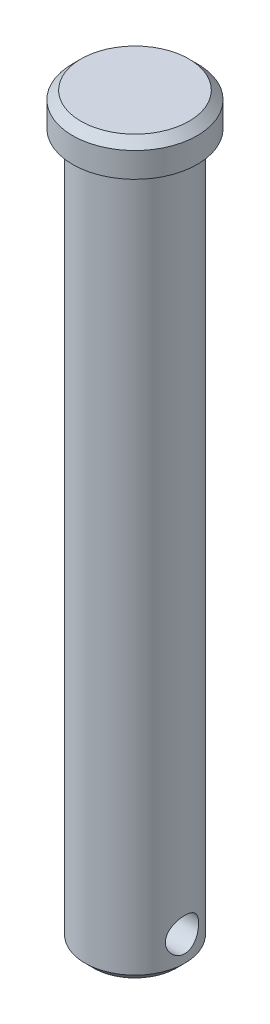
ISO-10303-21;
HEADER;
FILE_DESCRIPTION(('STEP AP214'),'2;1');
FILE_NAME('part.step','',(''),(''),'','','');
FILE_SCHEMA(('AUTOMOTIVE_DESIGN { 1 0 10303 214 1 1 1 1 }'));
ENDSEC;
DATA;
#1=APPLICATION_CONTEXT('core data for automotive mechanical design processes');
#2=APPLICATION_PROTOCOL_DEFINITION('international standard','automotive_design',2000,#1);
#3=PRODUCT_CONTEXT('',#1,'mechanical');
#4=PRODUCT('Part','Part','',(#3));
#5=PRODUCT_RELATED_PRODUCT_CATEGORY('part','',(#4));
#6=PRODUCT_DEFINITION_FORMATION('','',#4);
#7=PRODUCT_DEFINITION_CONTEXT('part definition',#1,'design');
#8=PRODUCT_DEFINITION('design','',#6,#7);
#9=PRODUCT_DEFINITION_SHAPE('','',#8);
#10=(LENGTH_UNIT() NAMED_UNIT(*) SI_UNIT(.MILLI.,.METRE.));
#11=(NAMED_UNIT(*) PLANE_ANGLE_UNIT() SI_UNIT($,.RADIAN.));
#12=(NAMED_UNIT(*) SI_UNIT($,.STERADIAN.) SOLID_ANGLE_UNIT());
#13=UNCERTAINTY_MEASURE_WITH_UNIT(LENGTH_MEASURE(1.E-05),#10,'distance_accuracy_value','');
#14=(GEOMETRIC_REPRESENTATION_CONTEXT(3) GLOBAL_UNCERTAINTY_ASSIGNED_CONTEXT((#13)) GLOBAL_UNIT_ASSIGNED_CONTEXT((#10,
#11,#12)) REPRESENTATION_CONTEXT('',''));
#15=CARTESIAN_POINT('',(0.,0.,0.));
#16=DIRECTION('',(0.,0.,1.));
#17=DIRECTION('',(1.,0.,0.));
#18=AXIS2_PLACEMENT_3D('',#15,#16,#17);
#19=CARTESIAN_POINT('',(0.,8.,0.));
#20=DIRECTION('',(0.,-1.,0.));
#21=DIRECTION('',(0.,0.,-1.));
#22=AXIS2_PLACEMENT_3D('',#19,#20,#21);
#23=CYLINDRICAL_SURFACE('',#22,15.);
#24=CARTESIAN_POINT('',(0.,5.99999999999998,0.));
#25=DIRECTION('',(0.,1.,0.));
#26=DIRECTION('',(0.,0.,1.));
#27=AXIS2_PLACEMENT_3D('',#24,#25,#26);
#28=CIRCLE('',#27,15.);
#29=CARTESIAN_POINT('',(0.,5.99999999999998,15.));
#30=VERTEX_POINT('',#29);
#31=EDGE_CURVE('E12',#30,#30,#28,.F.);
#32=ORIENTED_EDGE('',*,*,#31,.T.);
#33=EDGE_LOOP('',(#32));
#34=FACE_BOUND('',#33,.T.);
#35=CARTESIAN_POINT('',(0.,0.,0.));
#36=DIRECTION('',(0.,1.,0.));
#37=DIRECTION('',(0.,0.,1.));
#38=AXIS2_PLACEMENT_3D('',#35,#36,#37);
#39=CIRCLE('',#38,15.);
#40=CARTESIAN_POINT('',(0.,0.,15.));
#41=VERTEX_POINT('',#40);
#42=EDGE_CURVE('E80',#41,#41,#39,.T.);
#43=ORIENTED_EDGE('',*,*,#42,.T.);
#44=EDGE_LOOP('',(#43));
#45=FACE_BOUND('',#44,.T.);
#46=ADVANCED_FACE('F51',(#34,#45),#23,.T.);
#47=CARTESIAN_POINT('',(0.,8.,0.));
#48=DIRECTION('',(0.,1.,0.));
#49=DIRECTION('',(0.,0.,1.));
#50=AXIS2_PLACEMENT_3D('',#47,#48,#49);
#51=PLANE('',#50);
#52=CARTESIAN_POINT('',(0.,8.,0.));
#53=DIRECTION('',(0.,1.,0.));
#54=DIRECTION('',(0.,0.,1.));
#55=AXIS2_PLACEMENT_3D('',#52,#53,#54);
#56=CIRCLE('',#55,13.);
#57=CARTESIAN_POINT('',(0.,8.,13.));
#58=VERTEX_POINT('',#57);
#59=EDGE_CURVE('E58',#58,#58,#56,.T.);
#60=ORIENTED_EDGE('',*,*,#59,.T.);
#61=EDGE_LOOP('',(#60));
#62=FACE_BOUND('',#61,.T.);
#63=ADVANCED_FACE('F106',(#62),#51,.T.);
#64=CARTESIAN_POINT('',(0.,0.,0.));
#65=DIRECTION('',(0.,1.,0.));
#66=DIRECTION('',(0.,0.,1.));
#67=AXIS2_PLACEMENT_3D('',#64,#65,#66);
#68=PLANE('',#67);
#69=CARTESIAN_POINT('',(0.,0.,0.));
#70=DIRECTION('',(0.,-1.,0.));
#71=DIRECTION('',(0.,0.,-1.));
#72=AXIS2_PLACEMENT_3D('',#69,#70,#71);
#73=CIRCLE('',#72,12.);
#74=CARTESIAN_POINT('',(0.,0.,-12.));
#75=VERTEX_POINT('',#74);
#76=EDGE_CURVE('E71',#75,#75,#73,.T.);
#77=ORIENTED_EDGE('',*,*,#76,.F.);
#78=EDGE_LOOP('',(#77));
#79=FACE_BOUND('',#78,.T.);
#80=ORIENTED_EDGE('',*,*,#42,.F.);
#81=EDGE_LOOP('',(#80));
#82=FACE_BOUND('',#81,.T.);
#83=ADVANCED_FACE('F103',(#79,#82),#68,.F.);
#84=CARTESIAN_POINT('',(0.,-170.,0.));
#85=DIRECTION('',(0.,1.,0.));
#86=DIRECTION('',(0.,0.,1.));
#87=AXIS2_PLACEMENT_3D('',#84,#85,#86);
#88=CYLINDRICAL_SURFACE('',#87,12.);
#89=CARTESIAN_POINT('',(0.,-168.,0.));
#90=DIRECTION('',(0.,-1.,0.));
#91=DIRECTION('',(0.,0.,-1.));
#92=AXIS2_PLACEMENT_3D('',#89,#90,#91);
#93=CIRCLE('',#92,12.);
#94=CARTESIAN_POINT('',(0.,-168.,-12.));
#95=VERTEX_POINT('',#94);
#96=EDGE_CURVE('E62',#95,#95,#93,.F.);
#97=ORIENTED_EDGE('',*,*,#96,.T.);
#98=EDGE_LOOP('',(#97));
#99=FACE_BOUND('',#98,.T.);
#100=CARTESIAN_POINT('',(-11.3137084989848,-162.,-4.00000000000001));
#101=CARTESIAN_POINT('',(-11.3137077812174,-161.782127300656,-4.00000103179086));
#102=CARTESIAN_POINT('',(-11.3200707716343,-161.564260800706,-3.9821391347421));
#103=CARTESIAN_POINT('',(-11.3447029632502,-161.134982316023,-3.91140452675524));
#104=CARTESIAN_POINT('',(-11.3629741256875,-160.92357140051,-3.8585260486736));
#105=CARTESIAN_POINT('',(-11.4091281475517,-160.513492428011,-3.71982194273963));
#106=CARTESIAN_POINT('',(-11.4369921588529,-160.314800282229,-3.634060885613));
#107=CARTESIAN_POINT('',(-11.499164880413,-159.934559805808,-3.43224651376554));
#108=CARTESIAN_POINT('',(-11.5334750121445,-159.753015269785,-3.31618651544075));
#109=CARTESIAN_POINT('',(-11.6061795762989,-159.405120150647,-3.05220458577153));
#110=CARTESIAN_POINT('',(-11.6446757937858,-159.239538285313,-2.9032973655117));
#111=CARTESIAN_POINT('',(-11.7205545920401,-158.935172795101,-2.5799506688576));
#112=CARTESIAN_POINT('',(-11.7579369931585,-158.796393473671,-2.40550710020952));
#113=CARTESIAN_POINT('',(-11.828554676872,-158.546084410682,-2.03041803186005));
#114=CARTESIAN_POINT('',(-11.8616563080642,-158.435360117528,-1.82920764489811));
#115=CARTESIAN_POINT('',(-11.9187834708393,-158.24963365949,-1.40972489194991));
#116=CARTESIAN_POINT('',(-11.9428114481201,-158.174621867292,-1.19145714274887));
#117=CARTESIAN_POINT('',(-11.9783630172763,-158.06505658147,-0.752115269733997));
#118=CARTESIAN_POINT('',(-11.9902925911024,-158.029186214972,-0.531403019411891));
#119=CARTESIAN_POINT('',(-12.0017443287299,-157.994734826557,-0.0867914992963724));
#120=CARTESIAN_POINT('',(-12.0012696905158,-157.99614419339,0.137106934175572));
#121=CARTESIAN_POINT('',(-11.9882415847493,-158.035377018264,0.57241406077525));
#122=CARTESIAN_POINT('',(-11.9761625902047,-158.071770113898,0.783968194366622));
#123=CARTESIAN_POINT('',(-11.9418786935893,-158.177571923922,1.19777375528868));
#124=CARTESIAN_POINT('',(-11.9196731052473,-158.246982875919,1.40002455111686));
#125=CARTESIAN_POINT('',(-11.867026811729,-158.417685269224,1.79260989936789));
#126=CARTESIAN_POINT('',(-11.8364817009606,-158.519383754186,1.98275288387538));
#127=CARTESIAN_POINT('',(-11.7703357215568,-158.751438821795,2.34369730210929));
#128=CARTESIAN_POINT('',(-11.7347334480587,-158.881803373311,2.51449333754137));
#129=CARTESIAN_POINT('',(-11.6602476739959,-159.174697573839,2.84040346620523));
#130=CARTESIAN_POINT('',(-11.6212886067551,-159.338452631366,2.99440062826109));
#131=CARTESIAN_POINT('',(-11.545893409956,-159.689794902906,3.27310903839269));
#132=CARTESIAN_POINT('',(-11.5094576698246,-159.877385782912,3.39781577312617));
#133=CARTESIAN_POINT('',(-11.4428210048445,-160.274614502414,3.61594982014298));
#134=CARTESIAN_POINT('',(-11.4127163713899,-160.484528525271,3.70890585448537));
#135=CARTESIAN_POINT('',(-11.3632660329754,-160.918285576858,3.85777277307736));
#136=CARTESIAN_POINT('',(-11.3439158194837,-161.142122724825,3.91369918298999));
#137=CARTESIAN_POINT('',(-11.3191854526234,-161.586553421646,3.9846451283901));
#138=CARTESIAN_POINT('',(-11.3132144127502,-161.806837698995,4.00139638203054));
#139=CARTESIAN_POINT('',(-11.3142668823674,-162.247104596456,3.99842175563889));
#140=CARTESIAN_POINT('',(-11.3212880316726,-162.467087264096,3.97870250090706));
#141=CARTESIAN_POINT('',(-11.346944723612,-162.892627862848,3.90490260620925));
#142=CARTESIAN_POINT('',(-11.3651730176336,-163.098421720603,3.85202557592275));
#143=CARTESIAN_POINT('',(-11.4107421468409,-163.498174424957,3.71485545024189));
#144=CARTESIAN_POINT('',(-11.4380845973936,-163.692131166363,3.6305567854537));
#145=CARTESIAN_POINT('',(-11.4998751038315,-164.069521683388,3.42989736295576));
#146=CARTESIAN_POINT('',(-11.5345210266251,-164.252426570567,3.31260447343401));
#147=CARTESIAN_POINT('',(-11.6066307492386,-164.596584209535,3.05034252223026));
#148=CARTESIAN_POINT('',(-11.6440953777518,-164.757830554645,2.90536530199515));
#149=CARTESIAN_POINT('',(-11.719801545514,-165.062111936363,2.58356682360132));
#150=CARTESIAN_POINT('',(-11.7579937431159,-165.203897560075,2.40554908218663));
#151=CARTESIAN_POINT('',(-11.8290740645243,-165.455664569392,2.02730916560105));
#152=CARTESIAN_POINT('',(-11.8619623767078,-165.56564708465,1.82708777945824));
#153=CARTESIAN_POINT('',(-11.9185762324241,-165.749680419447,1.41111944972921));
#154=CARTESIAN_POINT('',(-11.9423612001812,-165.823965108592,1.1954844932848));
#155=CARTESIAN_POINT('',(-11.978344433511,-165.93491096824,0.753833863384075));
#156=CARTESIAN_POINT('',(-11.9905468813608,-165.971585719522,0.527821967815567));
#157=CARTESIAN_POINT('',(-12.0016745294503,-166.005048310423,0.0832613434401717));
#158=CARTESIAN_POINT('',(-12.0011968035776,-166.00362981573,-0.135138895680067));
#159=CARTESIAN_POINT('',(-11.9884878607759,-165.965370767414,-0.56844458000069));
#160=CARTESIAN_POINT('',(-11.976257597343,-165.928533087389,-0.783350307276221));
#161=CARTESIAN_POINT('',(-11.9416365981765,-165.821671061696,-1.20016847772823));
#162=CARTESIAN_POINT('',(-11.9194103344459,-165.752183138588,-1.40223308365115));
#163=CARTESIAN_POINT('',(-11.8670864281798,-165.582489875611,-1.79191340375918));
#164=CARTESIAN_POINT('',(-11.8369873619207,-165.482278979212,-1.97952649656973));
#165=CARTESIAN_POINT('',(-11.7706347531152,-165.249721951592,-2.34253606523514));
#166=CARTESIAN_POINT('',(-11.7341948996771,-165.116325258473,-2.51722500623042));
#167=CARTESIAN_POINT('',(-11.6597195516752,-164.822970435375,-2.84232410508971));
#168=CARTESIAN_POINT('',(-11.6216835509239,-164.663003830949,-2.99272648649837));
#169=CARTESIAN_POINT('',(-11.5465311930239,-164.313562577652,-3.27096723533248));
#170=CARTESIAN_POINT('',(-11.5095091195452,-164.123177956093,-3.39769186399161));
#171=CARTESIAN_POINT('',(-11.4424077329206,-163.722662292389,-3.61725737320447));
#172=CARTESIAN_POINT('',(-11.41232660645,-163.512536427881,-3.71010710727791));
#173=CARTESIAN_POINT('',(-11.3640533682606,-163.088152703937,-3.85537531281667));
#174=CARTESIAN_POINT('',(-11.3453853142873,-162.874510945899,-3.90943163659809));
#175=CARTESIAN_POINT('',(-11.3202153415807,-162.440575798133,-3.98173728059708));
#176=CARTESIAN_POINT('',(-11.3137092246984,-162.220284730357,-3.99999895678638));
#177=CARTESIAN_POINT('',(-11.3137084989848,-162.,-4.00000000000001));
#178=B_SPLINE_CURVE_WITH_KNOTS('',3,(#100,#101,#102,#103,#104,#105,#106,#107,#108,#109,#110,
#111,#112,#113,#114,#115,#116,#117,#118,#119,#120,#121,#122,#123,#124,#125,#126,#127,#128,#129,
#130,#131,#132,#133,#134,#135,#136,#137,#138,#139,#140,#141,#142,#143,#144,#145,#146,#147,#148,
#149,#150,#151,#152,#153,#154,#155,#156,#157,#158,#159,#160,#161,#162,#163,#164,#165,#166,#167,
#168,#169,#170,#171,#172,#173,#174,#175,#176,#177),.UNSPECIFIED.,.T.,.F.,(4,2,2,2,2,2,2,2,2,2,2,
2,2,2,2,2,2,2,2,2,2,2,2,2,2,2,2,2,2,2,2,2,2,2,2,2,2,2,4),(0.,0.652802339197435,1.30571222006065,
1.95734651000331,2.60912466474177,3.2840534971027,3.95909060687951,4.65174024574629,
5.34420305547156,6.01257275059737,6.6807701320931,7.32276019302277,7.96479376756948,
8.61526619441341,9.26591967496089,9.94720697455671,10.6285991844842,11.3197055937223,
12.0105220542647,12.6701716545776,13.3297014334894,13.9665758307511,14.6035631658779,
15.2607543094286,15.9181394264851,16.6071523268437,17.2961407503013,17.9805516476341,
18.6647153201663,19.3167233871055,19.9686785603913,20.6102782416172,21.2519940305297,
21.9174207808254,22.5830601773053,23.2747561094458,23.9662711306747,24.6265284865077,
25.2865578876186),.UNSPECIFIED.);
#179=CARTESIAN_POINT('',(-11.3137084989848,-162.,-4.00000000000001));
#180=VERTEX_POINT('',#179);
#181=EDGE_CURVE('E72',#180,#180,#178,.T.);
#182=ORIENTED_EDGE('',*,*,#181,.T.);
#183=EDGE_LOOP('',(#182));
#184=FACE_BOUND('',#183,.T.);
#185=CARTESIAN_POINT('',(11.3137084989848,-162.,-4.00000000000001));
#186=CARTESIAN_POINT('',(11.3137077812174,-162.217872699344,-4.00000103179086));
#187=CARTESIAN_POINT('',(11.3200707716343,-162.435739199294,-3.9821391347421));
#188=CARTESIAN_POINT('',(11.3447029632502,-162.865017683977,-3.91140452675524));
#189=CARTESIAN_POINT('',(11.3629741256875,-163.07642859949,-3.8585260486736));
#190=CARTESIAN_POINT('',(11.4091281475517,-163.486507571989,-3.71982194273963));
#191=CARTESIAN_POINT('',(11.4369921588529,-163.685199717771,-3.634060885613));
#192=CARTESIAN_POINT('',(11.499164880413,-164.065440194192,-3.43224651376554));
#193=CARTESIAN_POINT('',(11.5334750121445,-164.246984730215,-3.31618651544075));
#194=CARTESIAN_POINT('',(11.6061795762989,-164.594879849353,-3.05220458577153));
#195=CARTESIAN_POINT('',(11.6446757937858,-164.760461714687,-2.9032973655117));
#196=CARTESIAN_POINT('',(11.7205545920401,-165.064827204899,-2.5799506688576));
#197=CARTESIAN_POINT('',(11.7579369931585,-165.203606526329,-2.40550710020952));
#198=CARTESIAN_POINT('',(11.828554676872,-165.453915589318,-2.03041803186005));
#199=CARTESIAN_POINT('',(11.8616563080642,-165.564639882472,-1.82920764489811));
#200=CARTESIAN_POINT('',(11.9187834708393,-165.75036634051,-1.40972489194991));
#201=CARTESIAN_POINT('',(11.9428114481201,-165.825378132708,-1.19145714274887));
#202=CARTESIAN_POINT('',(11.9783630172763,-165.93494341853,-0.752115269733997));
#203=CARTESIAN_POINT('',(11.9902925911024,-165.970813785028,-0.531403019411891));
#204=CARTESIAN_POINT('',(12.0017443287299,-166.005265173443,-0.0867914992963723));
#205=CARTESIAN_POINT('',(12.0012696905158,-166.00385580661,0.137106934175572));
#206=CARTESIAN_POINT('',(11.9882415847493,-165.964622981736,0.572414060775251));
#207=CARTESIAN_POINT('',(11.9761625902047,-165.928229886102,0.783968194366623));
#208=CARTESIAN_POINT('',(11.9418786935893,-165.822428076078,1.19777375528869));
#209=CARTESIAN_POINT('',(11.9196731052473,-165.753017124081,1.40002455111686));
#210=CARTESIAN_POINT('',(11.867026811729,-165.582314730776,1.79260989936789));
#211=CARTESIAN_POINT('',(11.8364817009606,-165.480616245814,1.98275288387538));
#212=CARTESIAN_POINT('',(11.7703357215568,-165.248561178205,2.34369730210929));
#213=CARTESIAN_POINT('',(11.7347334480587,-165.118196626689,2.51449333754137));
#214=CARTESIAN_POINT('',(11.6602476739959,-164.825302426161,2.84040346620523));
#215=CARTESIAN_POINT('',(11.6212886067551,-164.661547368634,2.99440062826107));
#216=CARTESIAN_POINT('',(11.545893409956,-164.310205097094,3.27310903839268));
#217=CARTESIAN_POINT('',(11.5094576698246,-164.122614217088,3.39781577312617));
#218=CARTESIAN_POINT('',(11.4428210048445,-163.725385497586,3.61594982014298));
#219=CARTESIAN_POINT('',(11.4127163713899,-163.515471474729,3.70890585448537));
#220=CARTESIAN_POINT('',(11.3632660329754,-163.081714423142,3.85777277307735));
#221=CARTESIAN_POINT('',(11.3439158194837,-162.857877275175,3.91369918298998));
#222=CARTESIAN_POINT('',(11.3191854526234,-162.413446578354,3.9846451283901));
#223=CARTESIAN_POINT('',(11.3132144127502,-162.193162301005,4.00139638203054));
#224=CARTESIAN_POINT('',(11.3142668823674,-161.752895403544,3.99842175563889));
#225=CARTESIAN_POINT('',(11.3212880316726,-161.532912735904,3.97870250090706));
#226=CARTESIAN_POINT('',(11.346944723612,-161.107372137152,3.90490260620925));
#227=CARTESIAN_POINT('',(11.3651730176336,-160.901578279397,3.85202557592275));
#228=CARTESIAN_POINT('',(11.4107421468409,-160.501825575043,3.71485545024189));
#229=CARTESIAN_POINT('',(11.4380845973936,-160.307868833637,3.6305567854537));
#230=CARTESIAN_POINT('',(11.4998751038315,-159.930478316612,3.42989736295576));
#231=CARTESIAN_POINT('',(11.5345210266251,-159.747573429433,3.312604473434));
#232=CARTESIAN_POINT('',(11.6066307492386,-159.403415790465,3.05034252223025));
#233=CARTESIAN_POINT('',(11.6440953777518,-159.242169445355,2.90536530199515));
#234=CARTESIAN_POINT('',(11.719801545514,-158.937888063637,2.58356682360132));
#235=CARTESIAN_POINT('',(11.7579937431159,-158.796102439925,2.40554908218663));
#236=CARTESIAN_POINT('',(11.8290740645243,-158.544335430608,2.02730916560105));
#237=CARTESIAN_POINT('',(11.8619623767078,-158.43435291535,1.82708777945824));
#238=CARTESIAN_POINT('',(11.9185762324241,-158.250319580553,1.41111944972921));
#239=CARTESIAN_POINT('',(11.9423612001812,-158.176034891408,1.1954844932848));
#240=CARTESIAN_POINT('',(11.978344433511,-158.06508903176,0.753833863384074));
#241=CARTESIAN_POINT('',(11.9905468813608,-158.028414280478,0.527821967815567));
#242=CARTESIAN_POINT('',(12.0016745294503,-157.994951689577,0.0832613434401719));
#243=CARTESIAN_POINT('',(12.0011968035776,-157.99637018427,-0.135138895680068));
#244=CARTESIAN_POINT('',(11.9884878607759,-158.034629232586,-0.568444580000691));
#245=CARTESIAN_POINT('',(11.976257597343,-158.071466912611,-0.783350307276222));
#246=CARTESIAN_POINT('',(11.9416365981765,-158.178328938304,-1.20016847772823));
#247=CARTESIAN_POINT('',(11.9194103344459,-158.247816861412,-1.40223308365115));
#248=CARTESIAN_POINT('',(11.8670864281798,-158.417510124389,-1.79191340375918));
#249=CARTESIAN_POINT('',(11.8369873619207,-158.517721020788,-1.97952649656973));
#250=CARTESIAN_POINT('',(11.7706347531152,-158.750278048408,-2.34253606523514));
#251=CARTESIAN_POINT('',(11.7341948996771,-158.883674741527,-2.51722500623044));
#252=CARTESIAN_POINT('',(11.6597195516752,-159.177029564625,-2.84232410508972));
#253=CARTESIAN_POINT('',(11.6216835509239,-159.336996169051,-2.99272648649837));
#254=CARTESIAN_POINT('',(11.5465311930239,-159.686437422348,-3.27096723533248));
#255=CARTESIAN_POINT('',(11.5095091195452,-159.876822043907,-3.39769186399161));
#256=CARTESIAN_POINT('',(11.4424077329206,-160.277337707611,-3.61725737320447));
#257=CARTESIAN_POINT('',(11.41232660645,-160.487463572119,-3.71010710727791));
#258=CARTESIAN_POINT('',(11.3640533682606,-160.911847296063,-3.85537531281667));
#259=CARTESIAN_POINT('',(11.3453853142873,-161.125489054101,-3.90943163659809));
#260=CARTESIAN_POINT('',(11.3202153415807,-161.559424201867,-3.98173728059708));
#261=CARTESIAN_POINT('',(11.3137092246984,-161.779715269643,-3.99999895678638));
#262=CARTESIAN_POINT('',(11.3137084989848,-162.,-4.00000000000001));
#263=B_SPLINE_CURVE_WITH_KNOTS('',3,(#185,#186,#187,#188,#189,#190,#191,#192,#193,#194,#195,
#196,#197,#198,#199,#200,#201,#202,#203,#204,#205,#206,#207,#208,#209,#210,#211,#212,#213,#214,
#215,#216,#217,#218,#219,#220,#221,#222,#223,#224,#225,#226,#227,#228,#229,#230,#231,#232,#233,
#234,#235,#236,#237,#238,#239,#240,#241,#242,#243,#244,#245,#246,#247,#248,#249,#250,#251,#252,
#253,#254,#255,#256,#257,#258,#259,#260,#261,#262),.UNSPECIFIED.,.T.,.F.,(4,2,2,2,2,2,2,2,2,2,2,
2,2,2,2,2,2,2,2,2,2,2,2,2,2,2,2,2,2,2,2,2,2,2,2,2,2,2,4),(0.,0.652802339197435,1.30571222006065,
1.95734651000331,2.60912466474177,3.2840534971027,3.95909060687951,4.65174024574629,
5.34420305547156,6.01257275059737,6.6807701320931,7.32276019302277,7.96479376756948,
8.61526619441341,9.26591967496089,9.9472069745567,10.6285991844842,11.3197055937222,
12.0105220542647,12.6701716545776,13.3297014334894,13.9665758307511,14.6035631658779,
15.2607543094286,15.9181394264851,16.6071523268437,17.2961407503013,17.9805516476341,
18.6647153201663,19.3167233871055,19.9686785603913,20.6102782416172,21.2519940305297,
21.9174207808254,22.5830601773053,23.2747561094459,23.9662711306747,24.6265284865077,
25.2865578876186),.UNSPECIFIED.);
#264=CARTESIAN_POINT('',(11.3137084989848,-162.,-4.00000000000001));
#265=VERTEX_POINT('',#264);
#266=EDGE_CURVE('E81',#265,#265,#263,.T.);
#267=ORIENTED_EDGE('',*,*,#266,.T.);
#268=EDGE_LOOP('',(#267));
#269=FACE_BOUND('',#268,.T.);
#270=ORIENTED_EDGE('',*,*,#76,.T.);
#271=EDGE_LOOP('',(#270));
#272=FACE_BOUND('',#271,.T.);
#273=ADVANCED_FACE('F86',(#99,#184,#269,#272),#88,.T.);
#274=CARTESIAN_POINT('',(0.,-170.,0.));
#275=DIRECTION('',(0.,-1.,0.));
#276=DIRECTION('',(0.,0.,-1.));
#277=AXIS2_PLACEMENT_3D('',#274,#275,#276);
#278=PLANE('',#277);
#279=CARTESIAN_POINT('',(0.,-170.,0.));
#280=DIRECTION('',(0.,-1.,0.));
#281=DIRECTION('',(0.,0.,-1.));
#282=AXIS2_PLACEMENT_3D('',#279,#280,#281);
#283=CIRCLE('',#282,9.99999999999998);
#284=CARTESIAN_POINT('',(0.,-170.,-9.99999999999998));
#285=VERTEX_POINT('',#284);
#286=EDGE_CURVE('E66',#285,#285,#283,.T.);
#287=ORIENTED_EDGE('',*,*,#286,.T.);
#288=EDGE_LOOP('',(#287));
#289=FACE_BOUND('',#288,.T.);
#290=ADVANCED_FACE('F94',(#289),#278,.T.);
#291=CARTESIAN_POINT('',(-15.,-162.,0.));
#292=DIRECTION('',(1.,0.,0.));
#293=DIRECTION('',(0.,0.,-1.));
#294=AXIS2_PLACEMENT_3D('',#291,#292,#293);
#295=CYLINDRICAL_SURFACE('',#294,4.00000000000001);
#296=ORIENTED_EDGE('',*,*,#266,.F.);
#297=EDGE_LOOP('',(#296));
#298=FACE_BOUND('',#297,.T.);
#299=ORIENTED_EDGE('',*,*,#181,.F.);
#300=EDGE_LOOP('',(#299));
#301=FACE_BOUND('',#300,.T.);
#302=ADVANCED_FACE('F90',(#298,#301),#295,.F.);
#303=CARTESIAN_POINT('',(0.,-170.,0.));
#304=DIRECTION('',(0.,1.,0.));
#305=DIRECTION('',(0.,0.,1.));
#306=AXIS2_PLACEMENT_3D('',#303,#304,#305);
#307=CONICAL_SURFACE('',#306,9.99999999999998,0.785398163397453);
#308=ORIENTED_EDGE('',*,*,#96,.F.);
#309=EDGE_LOOP('',(#308));
#310=FACE_BOUND('',#309,.T.);
#311=ORIENTED_EDGE('',*,*,#286,.F.);
#312=EDGE_LOOP('',(#311));
#313=FACE_BOUND('',#312,.T.);
#314=ADVANCED_FACE('F93',(#310,#313),#307,.T.);
#315=CARTESIAN_POINT('',(0.,8.,0.));
#316=DIRECTION('',(0.,-1.,0.));
#317=DIRECTION('',(0.,0.,-1.));
#318=AXIS2_PLACEMENT_3D('',#315,#316,#317);
#319=CONICAL_SURFACE('',#318,13.,0.785398163397449);
#320=ORIENTED_EDGE('',*,*,#31,.F.);
#321=EDGE_LOOP('',(#320));
#322=FACE_BOUND('',#321,.T.);
#323=ORIENTED_EDGE('',*,*,#59,.F.);
#324=EDGE_LOOP('',(#323));
#325=FACE_BOUND('',#324,.T.);
#326=ADVANCED_FACE('F53',(#322,#325),#319,.T.);
#327=CLOSED_SHELL('',(#46,#63,#83,#273,#290,#302,#314,#326));
#328=MANIFOLD_SOLID_BREP('B2',#327);
#329=ADVANCED_BREP_SHAPE_REPRESENTATION('',(#18,#328),#14);
#330=SHAPE_DEFINITION_REPRESENTATION(#9,#329);
ENDSEC;
END-ISO-10303-21;
